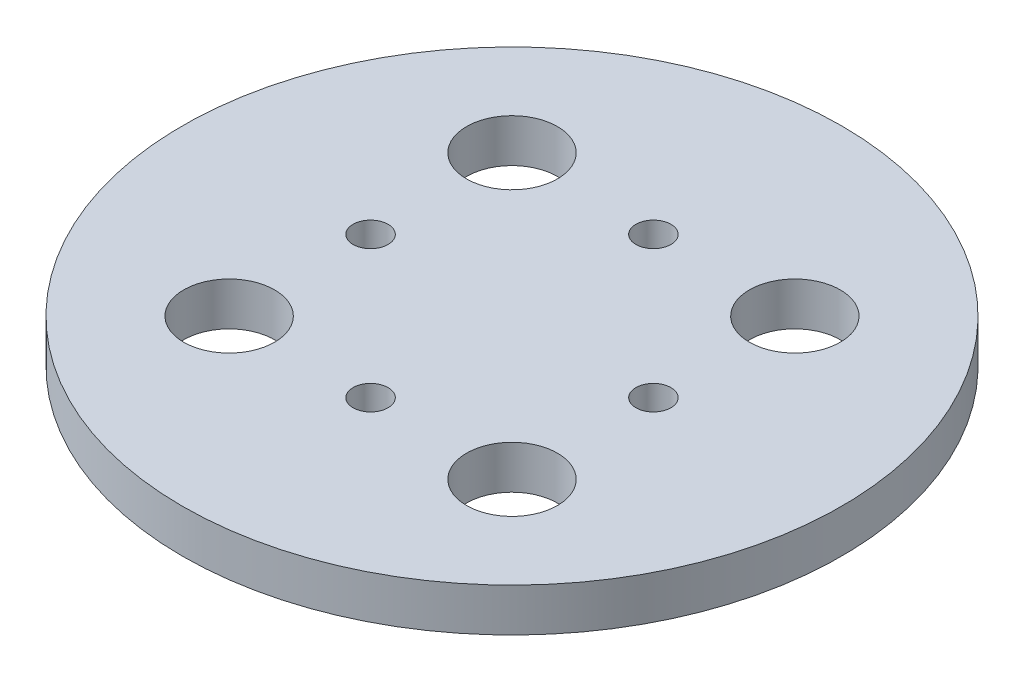
ISO-10303-21;
HEADER;
FILE_DESCRIPTION(('STEP AP214'),'2;1');
FILE_NAME('part.step','',(''),(''),'','','');
FILE_SCHEMA(('AUTOMOTIVE_DESIGN { 1 0 10303 214 1 1 1 1 }'));
ENDSEC;
DATA;
#1=APPLICATION_CONTEXT('core data for automotive mechanical design processes');
#2=APPLICATION_PROTOCOL_DEFINITION('international standard','automotive_design',2000,#1);
#3=PRODUCT_CONTEXT('',#1,'mechanical');
#4=PRODUCT('Part','Part','',(#3));
#5=PRODUCT_RELATED_PRODUCT_CATEGORY('part','',(#4));
#6=PRODUCT_DEFINITION_FORMATION('','',#4);
#7=PRODUCT_DEFINITION_CONTEXT('part definition',#1,'design');
#8=PRODUCT_DEFINITION('design','',#6,#7);
#9=PRODUCT_DEFINITION_SHAPE('','',#8);
#10=(LENGTH_UNIT() NAMED_UNIT(*) SI_UNIT(.MILLI.,.METRE.));
#11=(NAMED_UNIT(*) PLANE_ANGLE_UNIT() SI_UNIT($,.RADIAN.));
#12=(NAMED_UNIT(*) SI_UNIT($,.STERADIAN.) SOLID_ANGLE_UNIT());
#13=UNCERTAINTY_MEASURE_WITH_UNIT(LENGTH_MEASURE(1.E-05),#10,'distance_accuracy_value','');
#14=(GEOMETRIC_REPRESENTATION_CONTEXT(3) GLOBAL_UNCERTAINTY_ASSIGNED_CONTEXT((#13)) GLOBAL_UNIT_ASSIGNED_CONTEXT((#10,
#11,#12)) REPRESENTATION_CONTEXT('',''));
#15=CARTESIAN_POINT('',(0.,0.,0.));
#16=DIRECTION('',(0.,0.,1.));
#17=DIRECTION('',(1.,0.,0.));
#18=AXIS2_PLACEMENT_3D('',#15,#16,#17);
#19=CARTESIAN_POINT('',(0.,10.,0.));
#20=DIRECTION('',(0.,1.,0.));
#21=DIRECTION('',(0.,0.,1.));
#22=AXIS2_PLACEMENT_3D('',#19,#20,#21);
#23=PLANE('',#22);
#24=CARTESIAN_POINT('',(0.,10.,32.7));
#25=DIRECTION('',(0.,1.,0.));
#26=DIRECTION('',(0.,0.,1.));
#27=AXIS2_PLACEMENT_3D('',#24,#25,#26);
#28=CIRCLE('',#27,4.05);
#29=CARTESIAN_POINT('',(0.,10.,36.75));
#30=VERTEX_POINT('',#29);
#31=EDGE_CURVE('E81',#30,#30,#28,.T.);
#32=ORIENTED_EDGE('',*,*,#31,.F.);
#33=EDGE_LOOP('',(#32));
#34=FACE_BOUND('',#33,.T.);
#35=CARTESIAN_POINT('',(0.,10.,-32.7));
#36=DIRECTION('',(0.,1.,0.));
#37=DIRECTION('',(0.,0.,1.));
#38=AXIS2_PLACEMENT_3D('',#35,#36,#37);
#39=CIRCLE('',#38,4.05);
#40=CARTESIAN_POINT('',(0.,10.,-28.65));
#41=VERTEX_POINT('',#40);
#42=EDGE_CURVE('E69',#41,#41,#39,.T.);
#43=ORIENTED_EDGE('',*,*,#42,.F.);
#44=EDGE_LOOP('',(#43));
#45=FACE_BOUND('',#44,.T.);
#46=CARTESIAN_POINT('',(32.7,10.,32.7));
#47=DIRECTION('',(0.,1.,0.));
#48=DIRECTION('',(0.,0.,1.));
#49=AXIS2_PLACEMENT_3D('',#46,#47,#48);
#50=CIRCLE('',#49,10.5);
#51=CARTESIAN_POINT('',(32.7,10.,43.2));
#52=VERTEX_POINT('',#51);
#53=EDGE_CURVE('E57',#52,#52,#50,.T.);
#54=ORIENTED_EDGE('',*,*,#53,.F.);
#55=EDGE_LOOP('',(#54));
#56=FACE_BOUND('',#55,.T.);
#57=CARTESIAN_POINT('',(-32.7,10.,-32.7));
#58=DIRECTION('',(0.,1.,0.));
#59=DIRECTION('',(0.,0.,1.));
#60=AXIS2_PLACEMENT_3D('',#57,#58,#59);
#61=CIRCLE('',#60,10.5);
#62=CARTESIAN_POINT('',(-32.7,10.,-22.2));
#63=VERTEX_POINT('',#62);
#64=EDGE_CURVE('E46',#63,#63,#61,.T.);
#65=ORIENTED_EDGE('',*,*,#64,.F.);
#66=EDGE_LOOP('',(#65));
#67=FACE_BOUND('',#66,.T.);
#68=CARTESIAN_POINT('',(0.,10.,0.));
#69=DIRECTION('',(0.,1.,0.));
#70=DIRECTION('',(0.,0.,1.));
#71=AXIS2_PLACEMENT_3D('',#68,#69,#70);
#72=CIRCLE('',#71,76.2);
#73=CARTESIAN_POINT('',(0.,10.,76.2));
#74=VERTEX_POINT('',#73);
#75=EDGE_CURVE('E10',#74,#74,#72,.T.);
#76=ORIENTED_EDGE('',*,*,#75,.T.);
#77=EDGE_LOOP('',(#76));
#78=FACE_BOUND('',#77,.T.);
#79=CARTESIAN_POINT('',(32.7,10.,-32.7));
#80=DIRECTION('',(0.,1.,0.));
#81=DIRECTION('',(0.,0.,1.));
#82=AXIS2_PLACEMENT_3D('',#79,#80,#81);
#83=CIRCLE('',#82,10.5);
#84=CARTESIAN_POINT('',(32.7,10.,-22.2));
#85=VERTEX_POINT('',#84);
#86=EDGE_CURVE('E51',#85,#85,#83,.T.);
#87=ORIENTED_EDGE('',*,*,#86,.F.);
#88=EDGE_LOOP('',(#87));
#89=FACE_BOUND('',#88,.T.);
#90=CARTESIAN_POINT('',(-32.7,10.,32.7));
#91=DIRECTION('',(0.,1.,0.));
#92=DIRECTION('',(0.,0.,1.));
#93=AXIS2_PLACEMENT_3D('',#90,#91,#92);
#94=CIRCLE('',#93,10.5);
#95=CARTESIAN_POINT('',(-32.7,10.,43.2));
#96=VERTEX_POINT('',#95);
#97=EDGE_CURVE('E63',#96,#96,#94,.T.);
#98=ORIENTED_EDGE('',*,*,#97,.F.);
#99=EDGE_LOOP('',(#98));
#100=FACE_BOUND('',#99,.T.);
#101=CARTESIAN_POINT('',(32.7,10.,0.));
#102=DIRECTION('',(0.,1.,0.));
#103=DIRECTION('',(0.,0.,1.));
#104=AXIS2_PLACEMENT_3D('',#101,#102,#103);
#105=CIRCLE('',#104,4.05);
#106=CARTESIAN_POINT('',(32.7,10.,4.04999999999999));
#107=VERTEX_POINT('',#106);
#108=EDGE_CURVE('E75',#107,#107,#105,.T.);
#109=ORIENTED_EDGE('',*,*,#108,.F.);
#110=EDGE_LOOP('',(#109));
#111=FACE_BOUND('',#110,.T.);
#112=CARTESIAN_POINT('',(-32.7,10.,0.));
#113=DIRECTION('',(0.,1.,0.));
#114=DIRECTION('',(0.,0.,1.));
#115=AXIS2_PLACEMENT_3D('',#112,#113,#114);
#116=CIRCLE('',#115,4.05);
#117=CARTESIAN_POINT('',(-32.7,10.,4.05000000000001));
#118=VERTEX_POINT('',#117);
#119=EDGE_CURVE('E87',#118,#118,#116,.T.);
#120=ORIENTED_EDGE('',*,*,#119,.F.);
#121=EDGE_LOOP('',(#120));
#122=FACE_BOUND('',#121,.T.);
#123=ADVANCED_FACE('F35',(#34,#45,#56,#67,#78,#89,#100,#111,#122),#23,.T.);
#124=CARTESIAN_POINT('',(0.,0.,0.));
#125=DIRECTION('',(0.,1.,0.));
#126=DIRECTION('',(0.,0.,1.));
#127=AXIS2_PLACEMENT_3D('',#124,#125,#126);
#128=PLANE('',#127);
#129=CARTESIAN_POINT('',(0.,0.,0.));
#130=DIRECTION('',(0.,1.,0.));
#131=DIRECTION('',(0.,0.,1.));
#132=AXIS2_PLACEMENT_3D('',#129,#130,#131);
#133=CIRCLE('',#132,76.2);
#134=CARTESIAN_POINT('',(0.,0.,76.2));
#135=VERTEX_POINT('',#134);
#136=EDGE_CURVE('E39',#135,#135,#133,.T.);
#137=ORIENTED_EDGE('',*,*,#136,.F.);
#138=EDGE_LOOP('',(#137));
#139=FACE_BOUND('',#138,.T.);
#140=CARTESIAN_POINT('',(-32.7,0.,-32.7));
#141=DIRECTION('',(0.,1.,0.));
#142=DIRECTION('',(0.,0.,1.));
#143=AXIS2_PLACEMENT_3D('',#140,#141,#142);
#144=CIRCLE('',#143,10.5);
#145=CARTESIAN_POINT('',(-32.7,0.,-22.2));
#146=VERTEX_POINT('',#145);
#147=EDGE_CURVE('E48',#146,#146,#144,.T.);
#148=ORIENTED_EDGE('',*,*,#147,.T.);
#149=EDGE_LOOP('',(#148));
#150=FACE_BOUND('',#149,.T.);
#151=CARTESIAN_POINT('',(32.7,0.,-32.7));
#152=DIRECTION('',(0.,1.,0.));
#153=DIRECTION('',(0.,0.,1.));
#154=AXIS2_PLACEMENT_3D('',#151,#152,#153);
#155=CIRCLE('',#154,10.5);
#156=CARTESIAN_POINT('',(32.7,0.,-22.2));
#157=VERTEX_POINT('',#156);
#158=EDGE_CURVE('E54',#157,#157,#155,.T.);
#159=ORIENTED_EDGE('',*,*,#158,.T.);
#160=EDGE_LOOP('',(#159));
#161=FACE_BOUND('',#160,.T.);
#162=CARTESIAN_POINT('',(32.7,0.,32.7));
#163=DIRECTION('',(0.,1.,0.));
#164=DIRECTION('',(0.,0.,1.));
#165=AXIS2_PLACEMENT_3D('',#162,#163,#164);
#166=CIRCLE('',#165,10.5);
#167=CARTESIAN_POINT('',(32.7,0.,43.2));
#168=VERTEX_POINT('',#167);
#169=EDGE_CURVE('E60',#168,#168,#166,.T.);
#170=ORIENTED_EDGE('',*,*,#169,.T.);
#171=EDGE_LOOP('',(#170));
#172=FACE_BOUND('',#171,.T.);
#173=CARTESIAN_POINT('',(-32.7,0.,32.7));
#174=DIRECTION('',(0.,1.,0.));
#175=DIRECTION('',(0.,0.,1.));
#176=AXIS2_PLACEMENT_3D('',#173,#174,#175);
#177=CIRCLE('',#176,10.5);
#178=CARTESIAN_POINT('',(-32.7,0.,43.2));
#179=VERTEX_POINT('',#178);
#180=EDGE_CURVE('E66',#179,#179,#177,.T.);
#181=ORIENTED_EDGE('',*,*,#180,.T.);
#182=EDGE_LOOP('',(#181));
#183=FACE_BOUND('',#182,.T.);
#184=CARTESIAN_POINT('',(0.,0.,-32.7));
#185=DIRECTION('',(0.,1.,0.));
#186=DIRECTION('',(0.,0.,1.));
#187=AXIS2_PLACEMENT_3D('',#184,#185,#186);
#188=CIRCLE('',#187,4.05);
#189=CARTESIAN_POINT('',(0.,0.,-28.65));
#190=VERTEX_POINT('',#189);
#191=EDGE_CURVE('E72',#190,#190,#188,.T.);
#192=ORIENTED_EDGE('',*,*,#191,.T.);
#193=EDGE_LOOP('',(#192));
#194=FACE_BOUND('',#193,.T.);
#195=CARTESIAN_POINT('',(32.7,0.,0.));
#196=DIRECTION('',(0.,1.,0.));
#197=DIRECTION('',(0.,0.,1.));
#198=AXIS2_PLACEMENT_3D('',#195,#196,#197);
#199=CIRCLE('',#198,4.05);
#200=CARTESIAN_POINT('',(32.7,0.,4.04999999999999));
#201=VERTEX_POINT('',#200);
#202=EDGE_CURVE('E78',#201,#201,#199,.T.);
#203=ORIENTED_EDGE('',*,*,#202,.T.);
#204=EDGE_LOOP('',(#203));
#205=FACE_BOUND('',#204,.T.);
#206=CARTESIAN_POINT('',(0.,0.,32.7));
#207=DIRECTION('',(0.,1.,0.));
#208=DIRECTION('',(0.,0.,1.));
#209=AXIS2_PLACEMENT_3D('',#206,#207,#208);
#210=CIRCLE('',#209,4.05);
#211=CARTESIAN_POINT('',(0.,0.,36.75));
#212=VERTEX_POINT('',#211);
#213=EDGE_CURVE('E84',#212,#212,#210,.T.);
#214=ORIENTED_EDGE('',*,*,#213,.T.);
#215=EDGE_LOOP('',(#214));
#216=FACE_BOUND('',#215,.T.);
#217=CARTESIAN_POINT('',(-32.7,0.,0.));
#218=DIRECTION('',(0.,1.,0.));
#219=DIRECTION('',(0.,0.,1.));
#220=AXIS2_PLACEMENT_3D('',#217,#218,#219);
#221=CIRCLE('',#220,4.05);
#222=CARTESIAN_POINT('',(-32.7,0.,4.05000000000001));
#223=VERTEX_POINT('',#222);
#224=EDGE_CURVE('E90',#223,#223,#221,.T.);
#225=ORIENTED_EDGE('',*,*,#224,.T.);
#226=EDGE_LOOP('',(#225));
#227=FACE_BOUND('',#226,.T.);
#228=ADVANCED_FACE('F100',(#139,#150,#161,#172,#183,#194,#205,#216,#227),#128,.F.);
#229=CARTESIAN_POINT('',(0.,10.,0.));
#230=DIRECTION('',(0.,-1.,0.));
#231=DIRECTION('',(0.,0.,-1.));
#232=AXIS2_PLACEMENT_3D('',#229,#230,#231);
#233=CYLINDRICAL_SURFACE('',#232,76.2);
#234=ORIENTED_EDGE('',*,*,#75,.F.);
#235=EDGE_LOOP('',(#234));
#236=FACE_BOUND('',#235,.T.);
#237=ORIENTED_EDGE('',*,*,#136,.T.);
#238=EDGE_LOOP('',(#237));
#239=FACE_BOUND('',#238,.T.);
#240=ADVANCED_FACE('F37',(#236,#239),#233,.T.);
#241=CARTESIAN_POINT('',(-32.7,10.,-32.7));
#242=DIRECTION('',(0.,-1.,0.));
#243=DIRECTION('',(0.,0.,-1.));
#244=AXIS2_PLACEMENT_3D('',#241,#242,#243);
#245=CYLINDRICAL_SURFACE('',#244,10.5);
#246=ORIENTED_EDGE('',*,*,#64,.T.);
#247=EDGE_LOOP('',(#246));
#248=FACE_BOUND('',#247,.T.);
#249=ORIENTED_EDGE('',*,*,#147,.F.);
#250=EDGE_LOOP('',(#249));
#251=FACE_BOUND('',#250,.T.);
#252=ADVANCED_FACE('F110',(#248,#251),#245,.F.);
#253=CARTESIAN_POINT('',(32.7,10.,-32.7));
#254=DIRECTION('',(0.,-1.,0.));
#255=DIRECTION('',(0.,0.,-1.));
#256=AXIS2_PLACEMENT_3D('',#253,#254,#255);
#257=CYLINDRICAL_SURFACE('',#256,10.5);
#258=ORIENTED_EDGE('',*,*,#86,.T.);
#259=EDGE_LOOP('',(#258));
#260=FACE_BOUND('',#259,.T.);
#261=ORIENTED_EDGE('',*,*,#158,.F.);
#262=EDGE_LOOP('',(#261));
#263=FACE_BOUND('',#262,.T.);
#264=ADVANCED_FACE('F113',(#260,#263),#257,.F.);
#265=CARTESIAN_POINT('',(32.7,10.,32.7));
#266=DIRECTION('',(0.,-1.,0.));
#267=DIRECTION('',(0.,0.,-1.));
#268=AXIS2_PLACEMENT_3D('',#265,#266,#267);
#269=CYLINDRICAL_SURFACE('',#268,10.5);
#270=ORIENTED_EDGE('',*,*,#53,.T.);
#271=EDGE_LOOP('',(#270));
#272=FACE_BOUND('',#271,.T.);
#273=ORIENTED_EDGE('',*,*,#169,.F.);
#274=EDGE_LOOP('',(#273));
#275=FACE_BOUND('',#274,.T.);
#276=ADVANCED_FACE('F117',(#272,#275),#269,.F.);
#277=CARTESIAN_POINT('',(-32.7,10.,32.7));
#278=DIRECTION('',(0.,-1.,0.));
#279=DIRECTION('',(0.,0.,-1.));
#280=AXIS2_PLACEMENT_3D('',#277,#278,#279);
#281=CYLINDRICAL_SURFACE('',#280,10.5);
#282=ORIENTED_EDGE('',*,*,#97,.T.);
#283=EDGE_LOOP('',(#282));
#284=FACE_BOUND('',#283,.T.);
#285=ORIENTED_EDGE('',*,*,#180,.F.);
#286=EDGE_LOOP('',(#285));
#287=FACE_BOUND('',#286,.T.);
#288=ADVANCED_FACE('F121',(#284,#287),#281,.F.);
#289=CARTESIAN_POINT('',(0.,10.,-32.7));
#290=DIRECTION('',(0.,-1.,0.));
#291=DIRECTION('',(0.,0.,-1.));
#292=AXIS2_PLACEMENT_3D('',#289,#290,#291);
#293=CYLINDRICAL_SURFACE('',#292,4.05);
#294=ORIENTED_EDGE('',*,*,#42,.T.);
#295=EDGE_LOOP('',(#294));
#296=FACE_BOUND('',#295,.T.);
#297=ORIENTED_EDGE('',*,*,#191,.F.);
#298=EDGE_LOOP('',(#297));
#299=FACE_BOUND('',#298,.T.);
#300=ADVANCED_FACE('F125',(#296,#299),#293,.F.);
#301=CARTESIAN_POINT('',(32.7,10.,0.));
#302=DIRECTION('',(0.,-1.,0.));
#303=DIRECTION('',(0.,0.,-1.));
#304=AXIS2_PLACEMENT_3D('',#301,#302,#303);
#305=CYLINDRICAL_SURFACE('',#304,4.05);
#306=ORIENTED_EDGE('',*,*,#108,.T.);
#307=EDGE_LOOP('',(#306));
#308=FACE_BOUND('',#307,.T.);
#309=ORIENTED_EDGE('',*,*,#202,.F.);
#310=EDGE_LOOP('',(#309));
#311=FACE_BOUND('',#310,.T.);
#312=ADVANCED_FACE('F129',(#308,#311),#305,.F.);
#313=CARTESIAN_POINT('',(0.,10.,32.7));
#314=DIRECTION('',(0.,-1.,0.));
#315=DIRECTION('',(0.,0.,-1.));
#316=AXIS2_PLACEMENT_3D('',#313,#314,#315);
#317=CYLINDRICAL_SURFACE('',#316,4.05);
#318=ORIENTED_EDGE('',*,*,#31,.T.);
#319=EDGE_LOOP('',(#318));
#320=FACE_BOUND('',#319,.T.);
#321=ORIENTED_EDGE('',*,*,#213,.F.);
#322=EDGE_LOOP('',(#321));
#323=FACE_BOUND('',#322,.T.);
#324=ADVANCED_FACE('F133',(#320,#323),#317,.F.);
#325=CARTESIAN_POINT('',(-32.7,10.,0.));
#326=DIRECTION('',(0.,-1.,0.));
#327=DIRECTION('',(0.,0.,-1.));
#328=AXIS2_PLACEMENT_3D('',#325,#326,#327);
#329=CYLINDRICAL_SURFACE('',#328,4.05);
#330=ORIENTED_EDGE('',*,*,#119,.T.);
#331=EDGE_LOOP('',(#330));
#332=FACE_BOUND('',#331,.T.);
#333=ORIENTED_EDGE('',*,*,#224,.F.);
#334=EDGE_LOOP('',(#333));
#335=FACE_BOUND('',#334,.T.);
#336=ADVANCED_FACE('F96',(#332,#335),#329,.F.);
#337=CLOSED_SHELL('',(#123,#228,#240,#252,#264,#276,#288,#300,#312,#324,#336));
#338=MANIFOLD_SOLID_BREP('B2',#337);
#339=ADVANCED_BREP_SHAPE_REPRESENTATION('',(#18,#338),#14);
#340=SHAPE_DEFINITION_REPRESENTATION(#9,#339);
ENDSEC;
END-ISO-10303-21;
